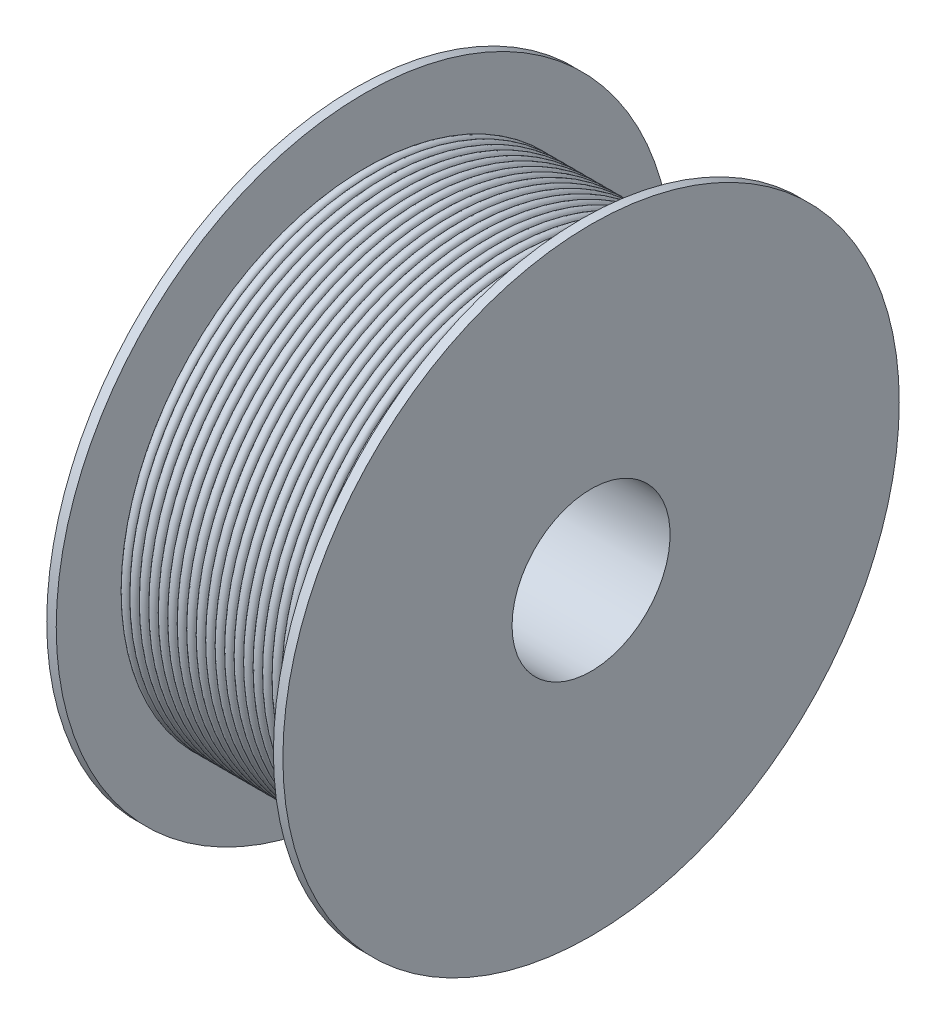
ISO-10303-21;
HEADER;
FILE_DESCRIPTION(('STEP AP214'),'2;1');
FILE_NAME('part.step','',(''),(''),'','','');
FILE_SCHEMA(('AUTOMOTIVE_DESIGN { 1 0 10303 214 1 1 1 1 }'));
ENDSEC;
DATA;
#1=APPLICATION_CONTEXT('core data for automotive mechanical design processes');
#2=APPLICATION_PROTOCOL_DEFINITION('international standard','automotive_design',2000,#1);
#3=PRODUCT_CONTEXT('',#1,'mechanical');
#4=PRODUCT('Part','Part','',(#3));
#5=PRODUCT_RELATED_PRODUCT_CATEGORY('part','',(#4));
#6=PRODUCT_DEFINITION_FORMATION('','',#4);
#7=PRODUCT_DEFINITION_CONTEXT('part definition',#1,'design');
#8=PRODUCT_DEFINITION('design','',#6,#7);
#9=PRODUCT_DEFINITION_SHAPE('','',#8);
#10=(LENGTH_UNIT() NAMED_UNIT(*) SI_UNIT(.MILLI.,.METRE.));
#11=(NAMED_UNIT(*) PLANE_ANGLE_UNIT() SI_UNIT($,.RADIAN.));
#12=(NAMED_UNIT(*) SI_UNIT($,.STERADIAN.) SOLID_ANGLE_UNIT());
#13=UNCERTAINTY_MEASURE_WITH_UNIT(LENGTH_MEASURE(1.E-05),#10,'distance_accuracy_value','');
#14=(GEOMETRIC_REPRESENTATION_CONTEXT(3) GLOBAL_UNCERTAINTY_ASSIGNED_CONTEXT((#13)) GLOBAL_UNIT_ASSIGNED_CONTEXT((#10,
#11,#12)) REPRESENTATION_CONTEXT('',''));
#15=CARTESIAN_POINT('',(0.,0.,0.));
#16=DIRECTION('',(0.,0.,1.));
#17=DIRECTION('',(1.,0.,0.));
#18=AXIS2_PLACEMENT_3D('',#15,#16,#17);
#19=CARTESIAN_POINT('',(-2.32735630179795,0.,-33.7830387952373));
#20=DIRECTION('',(-1.,0.,0.));
#21=DIRECTION('',(0.,0.,1.));
#22=AXIS2_PLACEMENT_3D('',#19,#20,#21);
#23=CYLINDRICAL_SURFACE('',#22,97.5);
#24=CARTESIAN_POINT('',(0.,0.,-33.7830387952373));
#25=DIRECTION('',(-1.,0.,0.));
#26=DIRECTION('',(0.,0.,1.));
#27=AXIS2_PLACEMENT_3D('',#24,#25,#26);
#28=CIRCLE('',#27,97.5);
#29=CARTESIAN_POINT('',(0.,0.,63.7169612047627));
#30=VERTEX_POINT('',#29);
#31=EDGE_CURVE('E193',#30,#30,#28,.T.);
#32=ORIENTED_EDGE('',*,*,#31,.F.);
#33=EDGE_LOOP('',(#32));
#34=FACE_BOUND('',#33,.T.);
#35=CARTESIAN_POINT('',(3.,0.,-33.7830387952373));
#36=DIRECTION('',(-1.,0.,0.));
#37=DIRECTION('',(0.,0.,1.));
#38=AXIS2_PLACEMENT_3D('',#35,#36,#37);
#39=CIRCLE('',#38,97.5);
#40=CARTESIAN_POINT('',(3.,0.,63.7169612047627));
#41=VERTEX_POINT('',#40);
#42=EDGE_CURVE('E10',#41,#41,#39,.T.);
#43=ORIENTED_EDGE('',*,*,#42,.T.);
#44=EDGE_LOOP('',(#43));
#45=FACE_BOUND('',#44,.T.);
#46=ADVANCED_FACE('F33',(#34,#45),#23,.T.);
#47=CARTESIAN_POINT('',(3.,0.,-131.283038795237));
#48=DIRECTION('',(-1.,0.,0.));
#49=DIRECTION('',(0.,0.,1.));
#50=AXIS2_PLACEMENT_3D('',#47,#48,#49);
#51=PLANE('',#50);
#52=ORIENTED_EDGE('',*,*,#42,.F.);
#53=EDGE_LOOP('',(#52));
#54=FACE_BOUND('',#53,.T.);
#55=CARTESIAN_POINT('',(3.,0.,-33.7830387952373));
#56=DIRECTION('',(-1.,0.,0.));
#57=DIRECTION('',(0.,0.,1.));
#58=AXIS2_PLACEMENT_3D('',#55,#56,#57);
#59=CIRCLE('',#58,76.4060254615636);
#60=CARTESIAN_POINT('',(3.,0.,42.6229866663263));
#61=VERTEX_POINT('',#60);
#62=EDGE_CURVE('E39',#61,#61,#59,.T.);
#63=ORIENTED_EDGE('',*,*,#62,.T.);
#64=EDGE_LOOP('',(#63));
#65=FACE_BOUND('',#64,.T.);
#66=ADVANCED_FACE('F200',(#54,#65),#51,.F.);
#67=CARTESIAN_POINT('',(4.37229886831147,0.,-33.7830387952373));
#68=DIRECTION('',(-1.,0.,0.));
#69=DIRECTION('',(0.,0.,1.));
#70=AXIS2_PLACEMENT_3D('',#67,#68,#69);
#71=TOROIDAL_SURFACE('',#70,76.4060254615636,1.37229886831147);
#72=ORIENTED_EDGE('',*,*,#62,.F.);
#73=EDGE_LOOP('',(#72));
#74=FACE_BOUND('',#73,.T.);
#75=CARTESIAN_POINT('',(5.74459773662295,0.,-33.7830387952373));
#76=DIRECTION('',(-1.,0.,0.));
#77=DIRECTION('',(0.,0.,1.));
#78=AXIS2_PLACEMENT_3D('',#75,#76,#77);
#79=CIRCLE('',#78,76.4060254615636);
#80=CARTESIAN_POINT('',(5.74459773662295,0.,42.6229866663263));
#81=VERTEX_POINT('',#80);
#82=EDGE_CURVE('E43',#81,#81,#79,.T.);
#83=ORIENTED_EDGE('',*,*,#82,.T.);
#84=EDGE_LOOP('',(#83));
#85=FACE_BOUND('',#84,.T.);
#86=ADVANCED_FACE('F204',(#74,#85),#71,.T.);
#87=CARTESIAN_POINT('',(7.11689660493443,0.,-33.7830387952373));
#88=DIRECTION('',(-1.,0.,0.));
#89=DIRECTION('',(0.,0.,1.));
#90=AXIS2_PLACEMENT_3D('',#87,#88,#89);
#91=TOROIDAL_SURFACE('',#90,76.4060254615636,1.37229886831148);
#92=ORIENTED_EDGE('',*,*,#82,.F.);
#93=EDGE_LOOP('',(#92));
#94=FACE_BOUND('',#93,.T.);
#95=CARTESIAN_POINT('',(8.4891954732459,0.,-33.7830387952373));
#96=DIRECTION('',(-1.,0.,0.));
#97=DIRECTION('',(0.,0.,1.));
#98=AXIS2_PLACEMENT_3D('',#95,#96,#97);
#99=CIRCLE('',#98,76.4060254615636);
#100=CARTESIAN_POINT('',(8.4891954732459,0.,42.6229866663263));
#101=VERTEX_POINT('',#100);
#102=EDGE_CURVE('E47',#101,#101,#99,.T.);
#103=ORIENTED_EDGE('',*,*,#102,.T.);
#104=EDGE_LOOP('',(#103));
#105=FACE_BOUND('',#104,.T.);
#106=ADVANCED_FACE('F209',(#94,#105),#91,.T.);
#107=CARTESIAN_POINT('',(-2.32735630179795,0.,-33.7830387952373));
#108=DIRECTION('',(-1.,0.,0.));
#109=DIRECTION('',(0.,0.,1.));
#110=AXIS2_PLACEMENT_3D('',#107,#108,#109);
#111=CYLINDRICAL_SURFACE('',#110,76.4060254615636);
#112=ORIENTED_EDGE('',*,*,#102,.F.);
#113=EDGE_LOOP('',(#112));
#114=FACE_BOUND('',#113,.T.);
#115=CARTESIAN_POINT('',(8.74459773662295,0.,-33.7830387952373));
#116=DIRECTION('',(-1.,0.,0.));
#117=DIRECTION('',(0.,0.,1.));
#118=AXIS2_PLACEMENT_3D('',#115,#116,#117);
#119=CIRCLE('',#118,76.4060254615636);
#120=CARTESIAN_POINT('',(8.74459773662295,0.,42.6229866663263));
#121=VERTEX_POINT('',#120);
#122=EDGE_CURVE('E52',#121,#121,#119,.T.);
#123=ORIENTED_EDGE('',*,*,#122,.T.);
#124=EDGE_LOOP('',(#123));
#125=FACE_BOUND('',#124,.T.);
#126=ADVANCED_FACE('F215',(#114,#125),#111,.T.);
#127=CARTESIAN_POINT('',(10.1168966049344,0.,-33.7830387952373));
#128=DIRECTION('',(-1.,0.,0.));
#129=DIRECTION('',(0.,0.,1.));
#130=AXIS2_PLACEMENT_3D('',#127,#128,#129);
#131=TOROIDAL_SURFACE('',#130,76.4060254615636,1.37229886831148);
#132=ORIENTED_EDGE('',*,*,#122,.F.);
#133=EDGE_LOOP('',(#132));
#134=FACE_BOUND('',#133,.T.);
#135=CARTESIAN_POINT('',(11.4891954732459,0.,-33.7830387952373));
#136=DIRECTION('',(-1.,0.,0.));
#137=DIRECTION('',(0.,0.,1.));
#138=AXIS2_PLACEMENT_3D('',#135,#136,#137);
#139=CIRCLE('',#138,76.4060254615636);
#140=CARTESIAN_POINT('',(11.4891954732459,0.,42.6229866663263));
#141=VERTEX_POINT('',#140);
#142=EDGE_CURVE('E55',#141,#141,#139,.T.);
#143=ORIENTED_EDGE('',*,*,#142,.T.);
#144=EDGE_LOOP('',(#143));
#145=FACE_BOUND('',#144,.T.);
#146=ADVANCED_FACE('F219',(#134,#145),#131,.T.);
#147=CARTESIAN_POINT('',(-2.32735630179795,0.,-33.7830387952373));
#148=DIRECTION('',(-1.,0.,0.));
#149=DIRECTION('',(0.,0.,1.));
#150=AXIS2_PLACEMENT_3D('',#147,#148,#149);
#151=CYLINDRICAL_SURFACE('',#150,76.4060254615636);
#152=ORIENTED_EDGE('',*,*,#142,.F.);
#153=EDGE_LOOP('',(#152));
#154=FACE_BOUND('',#153,.T.);
#155=CARTESIAN_POINT('',(11.744597736623,0.,-33.7830387952373));
#156=DIRECTION('',(-1.,0.,0.));
#157=DIRECTION('',(0.,0.,1.));
#158=AXIS2_PLACEMENT_3D('',#155,#156,#157);
#159=CIRCLE('',#158,76.4060254615636);
#160=CARTESIAN_POINT('',(11.744597736623,0.,42.6229866663263));
#161=VERTEX_POINT('',#160);
#162=EDGE_CURVE('E58',#161,#161,#159,.T.);
#163=ORIENTED_EDGE('',*,*,#162,.T.);
#164=EDGE_LOOP('',(#163));
#165=FACE_BOUND('',#164,.T.);
#166=ADVANCED_FACE('F223',(#154,#165),#151,.T.);
#167=CARTESIAN_POINT('',(13.1168966049344,0.,-33.7830387952373));
#168=DIRECTION('',(-1.,0.,0.));
#169=DIRECTION('',(0.,0.,1.));
#170=AXIS2_PLACEMENT_3D('',#167,#168,#169);
#171=TOROIDAL_SURFACE('',#170,76.4060254615636,1.37229886831148);
#172=ORIENTED_EDGE('',*,*,#162,.F.);
#173=EDGE_LOOP('',(#172));
#174=FACE_BOUND('',#173,.T.);
#175=CARTESIAN_POINT('',(14.4891954732459,0.,-33.7830387952373));
#176=DIRECTION('',(-1.,0.,0.));
#177=DIRECTION('',(0.,0.,1.));
#178=AXIS2_PLACEMENT_3D('',#175,#176,#177);
#179=CIRCLE('',#178,76.4060254615636);
#180=CARTESIAN_POINT('',(14.4891954732459,0.,42.6229866663263));
#181=VERTEX_POINT('',#180);
#182=EDGE_CURVE('E61',#181,#181,#179,.T.);
#183=ORIENTED_EDGE('',*,*,#182,.T.);
#184=EDGE_LOOP('',(#183));
#185=FACE_BOUND('',#184,.T.);
#186=ADVANCED_FACE('F227',(#174,#185),#171,.T.);
#187=CARTESIAN_POINT('',(-2.32735630179795,0.,-33.7830387952373));
#188=DIRECTION('',(-1.,0.,0.));
#189=DIRECTION('',(0.,0.,1.));
#190=AXIS2_PLACEMENT_3D('',#187,#188,#189);
#191=CYLINDRICAL_SURFACE('',#190,76.4060254615636);
#192=ORIENTED_EDGE('',*,*,#182,.F.);
#193=EDGE_LOOP('',(#192));
#194=FACE_BOUND('',#193,.T.);
#195=CARTESIAN_POINT('',(14.744597736623,0.,-33.7830387952373));
#196=DIRECTION('',(-1.,0.,0.));
#197=DIRECTION('',(0.,0.,1.));
#198=AXIS2_PLACEMENT_3D('',#195,#196,#197);
#199=CIRCLE('',#198,76.4060254615636);
#200=CARTESIAN_POINT('',(14.744597736623,0.,42.6229866663263));
#201=VERTEX_POINT('',#200);
#202=EDGE_CURVE('E64',#201,#201,#199,.T.);
#203=ORIENTED_EDGE('',*,*,#202,.T.);
#204=EDGE_LOOP('',(#203));
#205=FACE_BOUND('',#204,.T.);
#206=ADVANCED_FACE('F231',(#194,#205),#191,.T.);
#207=CARTESIAN_POINT('',(16.1168966049344,0.,-33.7830387952373));
#208=DIRECTION('',(-1.,0.,0.));
#209=DIRECTION('',(0.,0.,1.));
#210=AXIS2_PLACEMENT_3D('',#207,#208,#209);
#211=TOROIDAL_SURFACE('',#210,76.4060254615636,1.37229886831148);
#212=ORIENTED_EDGE('',*,*,#202,.F.);
#213=EDGE_LOOP('',(#212));
#214=FACE_BOUND('',#213,.T.);
#215=CARTESIAN_POINT('',(17.4891954732459,0.,-33.7830387952373));
#216=DIRECTION('',(-1.,0.,0.));
#217=DIRECTION('',(0.,0.,1.));
#218=AXIS2_PLACEMENT_3D('',#215,#216,#217);
#219=CIRCLE('',#218,76.4060254615636);
#220=CARTESIAN_POINT('',(17.4891954732459,0.,42.6229866663263));
#221=VERTEX_POINT('',#220);
#222=EDGE_CURVE('E67',#221,#221,#219,.T.);
#223=ORIENTED_EDGE('',*,*,#222,.T.);
#224=EDGE_LOOP('',(#223));
#225=FACE_BOUND('',#224,.T.);
#226=ADVANCED_FACE('F235',(#214,#225),#211,.T.);
#227=CARTESIAN_POINT('',(-2.32735630179795,0.,-33.7830387952373));
#228=DIRECTION('',(-1.,0.,0.));
#229=DIRECTION('',(0.,0.,1.));
#230=AXIS2_PLACEMENT_3D('',#227,#228,#229);
#231=CYLINDRICAL_SURFACE('',#230,76.4060254615636);
#232=ORIENTED_EDGE('',*,*,#222,.F.);
#233=EDGE_LOOP('',(#232));
#234=FACE_BOUND('',#233,.T.);
#235=CARTESIAN_POINT('',(17.7445977366229,0.,-33.7830387952373));
#236=DIRECTION('',(-1.,0.,0.));
#237=DIRECTION('',(0.,0.,1.));
#238=AXIS2_PLACEMENT_3D('',#235,#236,#237);
#239=CIRCLE('',#238,76.4060254615636);
#240=CARTESIAN_POINT('',(17.7445977366229,0.,42.6229866663263));
#241=VERTEX_POINT('',#240);
#242=EDGE_CURVE('E70',#241,#241,#239,.T.);
#243=ORIENTED_EDGE('',*,*,#242,.T.);
#244=EDGE_LOOP('',(#243));
#245=FACE_BOUND('',#244,.T.);
#246=ADVANCED_FACE('F239',(#234,#245),#231,.T.);
#247=CARTESIAN_POINT('',(19.1168966049344,0.,-33.7830387952373));
#248=DIRECTION('',(-1.,0.,0.));
#249=DIRECTION('',(0.,0.,1.));
#250=AXIS2_PLACEMENT_3D('',#247,#248,#249);
#251=TOROIDAL_SURFACE('',#250,76.4060254615636,1.37229886831148);
#252=ORIENTED_EDGE('',*,*,#242,.F.);
#253=EDGE_LOOP('',(#252));
#254=FACE_BOUND('',#253,.T.);
#255=CARTESIAN_POINT('',(20.4891954732459,0.,-33.7830387952373));
#256=DIRECTION('',(-1.,0.,0.));
#257=DIRECTION('',(0.,0.,1.));
#258=AXIS2_PLACEMENT_3D('',#255,#256,#257);
#259=CIRCLE('',#258,76.4060254615636);
#260=CARTESIAN_POINT('',(20.4891954732459,0.,42.6229866663263));
#261=VERTEX_POINT('',#260);
#262=EDGE_CURVE('E73',#261,#261,#259,.T.);
#263=ORIENTED_EDGE('',*,*,#262,.T.);
#264=EDGE_LOOP('',(#263));
#265=FACE_BOUND('',#264,.T.);
#266=ADVANCED_FACE('F243',(#254,#265),#251,.T.);
#267=CARTESIAN_POINT('',(-2.32735630179795,0.,-33.7830387952373));
#268=DIRECTION('',(-1.,0.,0.));
#269=DIRECTION('',(0.,0.,1.));
#270=AXIS2_PLACEMENT_3D('',#267,#268,#269);
#271=CYLINDRICAL_SURFACE('',#270,76.4060254615636);
#272=ORIENTED_EDGE('',*,*,#262,.F.);
#273=EDGE_LOOP('',(#272));
#274=FACE_BOUND('',#273,.T.);
#275=CARTESIAN_POINT('',(20.7445977366229,0.,-33.7830387952373));
#276=DIRECTION('',(-1.,0.,0.));
#277=DIRECTION('',(0.,0.,1.));
#278=AXIS2_PLACEMENT_3D('',#275,#276,#277);
#279=CIRCLE('',#278,76.4060254615636);
#280=CARTESIAN_POINT('',(20.7445977366229,0.,42.6229866663263));
#281=VERTEX_POINT('',#280);
#282=EDGE_CURVE('E76',#281,#281,#279,.T.);
#283=ORIENTED_EDGE('',*,*,#282,.T.);
#284=EDGE_LOOP('',(#283));
#285=FACE_BOUND('',#284,.T.);
#286=ADVANCED_FACE('F247',(#274,#285),#271,.T.);
#287=CARTESIAN_POINT('',(22.1168966049344,0.,-33.7830387952373));
#288=DIRECTION('',(-1.,0.,0.));
#289=DIRECTION('',(0.,0.,1.));
#290=AXIS2_PLACEMENT_3D('',#287,#288,#289);
#291=TOROIDAL_SURFACE('',#290,76.4060254615636,1.37229886831148);
#292=ORIENTED_EDGE('',*,*,#282,.F.);
#293=EDGE_LOOP('',(#292));
#294=FACE_BOUND('',#293,.T.);
#295=CARTESIAN_POINT('',(23.4891954732459,0.,-33.7830387952373));
#296=DIRECTION('',(-1.,0.,0.));
#297=DIRECTION('',(0.,0.,1.));
#298=AXIS2_PLACEMENT_3D('',#295,#296,#297);
#299=CIRCLE('',#298,76.4060254615636);
#300=CARTESIAN_POINT('',(23.4891954732459,0.,42.6229866663263));
#301=VERTEX_POINT('',#300);
#302=EDGE_CURVE('E79',#301,#301,#299,.T.);
#303=ORIENTED_EDGE('',*,*,#302,.T.);
#304=EDGE_LOOP('',(#303));
#305=FACE_BOUND('',#304,.T.);
#306=ADVANCED_FACE('F251',(#294,#305),#291,.T.);
#307=CARTESIAN_POINT('',(-2.32735630179795,0.,-33.7830387952373));
#308=DIRECTION('',(-1.,0.,0.));
#309=DIRECTION('',(0.,0.,1.));
#310=AXIS2_PLACEMENT_3D('',#307,#308,#309);
#311=CYLINDRICAL_SURFACE('',#310,76.4060254615636);
#312=ORIENTED_EDGE('',*,*,#302,.F.);
#313=EDGE_LOOP('',(#312));
#314=FACE_BOUND('',#313,.T.);
#315=CARTESIAN_POINT('',(23.744597736623,0.,-33.7830387952373));
#316=DIRECTION('',(-1.,0.,0.));
#317=DIRECTION('',(0.,0.,1.));
#318=AXIS2_PLACEMENT_3D('',#315,#316,#317);
#319=CIRCLE('',#318,76.4060254615636);
#320=CARTESIAN_POINT('',(23.744597736623,0.,42.6229866663263));
#321=VERTEX_POINT('',#320);
#322=EDGE_CURVE('E82',#321,#321,#319,.T.);
#323=ORIENTED_EDGE('',*,*,#322,.T.);
#324=EDGE_LOOP('',(#323));
#325=FACE_BOUND('',#324,.T.);
#326=ADVANCED_FACE('F255',(#314,#325),#311,.T.);
#327=CARTESIAN_POINT('',(25.1168966049344,0.,-33.7830387952373));
#328=DIRECTION('',(-1.,0.,0.));
#329=DIRECTION('',(0.,0.,1.));
#330=AXIS2_PLACEMENT_3D('',#327,#328,#329);
#331=TOROIDAL_SURFACE('',#330,76.4060254615636,1.37229886831148);
#332=ORIENTED_EDGE('',*,*,#322,.F.);
#333=EDGE_LOOP('',(#332));
#334=FACE_BOUND('',#333,.T.);
#335=CARTESIAN_POINT('',(26.4891954732459,0.,-33.7830387952373));
#336=DIRECTION('',(-1.,0.,0.));
#337=DIRECTION('',(0.,0.,1.));
#338=AXIS2_PLACEMENT_3D('',#335,#336,#337);
#339=CIRCLE('',#338,76.4060254615636);
#340=CARTESIAN_POINT('',(26.4891954732459,0.,42.6229866663263));
#341=VERTEX_POINT('',#340);
#342=EDGE_CURVE('E85',#341,#341,#339,.T.);
#343=ORIENTED_EDGE('',*,*,#342,.T.);
#344=EDGE_LOOP('',(#343));
#345=FACE_BOUND('',#344,.T.);
#346=ADVANCED_FACE('F259',(#334,#345),#331,.T.);
#347=CARTESIAN_POINT('',(-2.32735630179795,0.,-33.7830387952373));
#348=DIRECTION('',(-1.,0.,0.));
#349=DIRECTION('',(0.,0.,1.));
#350=AXIS2_PLACEMENT_3D('',#347,#348,#349);
#351=CYLINDRICAL_SURFACE('',#350,76.4060254615636);
#352=ORIENTED_EDGE('',*,*,#342,.F.);
#353=EDGE_LOOP('',(#352));
#354=FACE_BOUND('',#353,.T.);
#355=CARTESIAN_POINT('',(26.744597736623,0.,-33.7830387952373));
#356=DIRECTION('',(-1.,0.,0.));
#357=DIRECTION('',(0.,0.,1.));
#358=AXIS2_PLACEMENT_3D('',#355,#356,#357);
#359=CIRCLE('',#358,76.4060254615636);
#360=CARTESIAN_POINT('',(26.744597736623,0.,42.6229866663263));
#361=VERTEX_POINT('',#360);
#362=EDGE_CURVE('E88',#361,#361,#359,.T.);
#363=ORIENTED_EDGE('',*,*,#362,.T.);
#364=EDGE_LOOP('',(#363));
#365=FACE_BOUND('',#364,.T.);
#366=ADVANCED_FACE('F263',(#354,#365),#351,.T.);
#367=CARTESIAN_POINT('',(28.1168966049344,0.,-33.7830387952373));
#368=DIRECTION('',(-1.,0.,0.));
#369=DIRECTION('',(0.,0.,1.));
#370=AXIS2_PLACEMENT_3D('',#367,#368,#369);
#371=TOROIDAL_SURFACE('',#370,76.4060254615636,1.37229886831148);
#372=ORIENTED_EDGE('',*,*,#362,.F.);
#373=EDGE_LOOP('',(#372));
#374=FACE_BOUND('',#373,.T.);
#375=CARTESIAN_POINT('',(29.4891954732459,0.,-33.7830387952373));
#376=DIRECTION('',(-1.,0.,0.));
#377=DIRECTION('',(0.,0.,1.));
#378=AXIS2_PLACEMENT_3D('',#375,#376,#377);
#379=CIRCLE('',#378,76.4060254615636);
#380=CARTESIAN_POINT('',(29.4891954732459,0.,42.6229866663263));
#381=VERTEX_POINT('',#380);
#382=EDGE_CURVE('E91',#381,#381,#379,.T.);
#383=ORIENTED_EDGE('',*,*,#382,.T.);
#384=EDGE_LOOP('',(#383));
#385=FACE_BOUND('',#384,.T.);
#386=ADVANCED_FACE('F267',(#374,#385),#371,.T.);
#387=CARTESIAN_POINT('',(-2.32735630179795,0.,-33.7830387952373));
#388=DIRECTION('',(-1.,0.,0.));
#389=DIRECTION('',(0.,0.,1.));
#390=AXIS2_PLACEMENT_3D('',#387,#388,#389);
#391=CYLINDRICAL_SURFACE('',#390,76.4060254615636);
#392=ORIENTED_EDGE('',*,*,#382,.F.);
#393=EDGE_LOOP('',(#392));
#394=FACE_BOUND('',#393,.T.);
#395=CARTESIAN_POINT('',(29.7445977366229,0.,-33.7830387952373));
#396=DIRECTION('',(-1.,0.,0.));
#397=DIRECTION('',(0.,0.,1.));
#398=AXIS2_PLACEMENT_3D('',#395,#396,#397);
#399=CIRCLE('',#398,76.4060254615636);
#400=CARTESIAN_POINT('',(29.7445977366229,0.,42.6229866663263));
#401=VERTEX_POINT('',#400);
#402=EDGE_CURVE('E94',#401,#401,#399,.T.);
#403=ORIENTED_EDGE('',*,*,#402,.T.);
#404=EDGE_LOOP('',(#403));
#405=FACE_BOUND('',#404,.T.);
#406=ADVANCED_FACE('F271',(#394,#405),#391,.T.);
#407=CARTESIAN_POINT('',(31.1168966049344,0.,-33.7830387952373));
#408=DIRECTION('',(-1.,0.,0.));
#409=DIRECTION('',(0.,0.,1.));
#410=AXIS2_PLACEMENT_3D('',#407,#408,#409);
#411=TOROIDAL_SURFACE('',#410,76.4060254615636,1.37229886831147);
#412=ORIENTED_EDGE('',*,*,#402,.F.);
#413=EDGE_LOOP('',(#412));
#414=FACE_BOUND('',#413,.T.);
#415=CARTESIAN_POINT('',(32.4891954732459,0.,-33.7830387952373));
#416=DIRECTION('',(-1.,0.,0.));
#417=DIRECTION('',(0.,0.,1.));
#418=AXIS2_PLACEMENT_3D('',#415,#416,#417);
#419=CIRCLE('',#418,76.4060254615636);
#420=CARTESIAN_POINT('',(32.4891954732459,0.,42.6229866663263));
#421=VERTEX_POINT('',#420);
#422=EDGE_CURVE('E97',#421,#421,#419,.T.);
#423=ORIENTED_EDGE('',*,*,#422,.T.);
#424=EDGE_LOOP('',(#423));
#425=FACE_BOUND('',#424,.T.);
#426=ADVANCED_FACE('F275',(#414,#425),#411,.T.);
#427=CARTESIAN_POINT('',(-2.32735630179795,0.,-33.7830387952373));
#428=DIRECTION('',(-1.,0.,0.));
#429=DIRECTION('',(0.,0.,1.));
#430=AXIS2_PLACEMENT_3D('',#427,#428,#429);
#431=CYLINDRICAL_SURFACE('',#430,76.4060254615636);
#432=ORIENTED_EDGE('',*,*,#422,.F.);
#433=EDGE_LOOP('',(#432));
#434=FACE_BOUND('',#433,.T.);
#435=CARTESIAN_POINT('',(32.744597736623,0.,-33.7830387952373));
#436=DIRECTION('',(-1.,0.,0.));
#437=DIRECTION('',(0.,0.,1.));
#438=AXIS2_PLACEMENT_3D('',#435,#436,#437);
#439=CIRCLE('',#438,76.4060254615636);
#440=CARTESIAN_POINT('',(32.744597736623,0.,42.6229866663263));
#441=VERTEX_POINT('',#440);
#442=EDGE_CURVE('E100',#441,#441,#439,.T.);
#443=ORIENTED_EDGE('',*,*,#442,.T.);
#444=EDGE_LOOP('',(#443));
#445=FACE_BOUND('',#444,.T.);
#446=ADVANCED_FACE('F279',(#434,#445),#431,.T.);
#447=CARTESIAN_POINT('',(34.1168966049344,0.,-33.7830387952373));
#448=DIRECTION('',(-1.,0.,0.));
#449=DIRECTION('',(0.,0.,1.));
#450=AXIS2_PLACEMENT_3D('',#447,#448,#449);
#451=TOROIDAL_SURFACE('',#450,76.4060254615636,1.37229886831148);
#452=ORIENTED_EDGE('',*,*,#442,.F.);
#453=EDGE_LOOP('',(#452));
#454=FACE_BOUND('',#453,.T.);
#455=CARTESIAN_POINT('',(35.4891954732459,0.,-33.7830387952373));
#456=DIRECTION('',(-1.,0.,0.));
#457=DIRECTION('',(0.,0.,1.));
#458=AXIS2_PLACEMENT_3D('',#455,#456,#457);
#459=CIRCLE('',#458,76.4060254615636);
#460=CARTESIAN_POINT('',(35.4891954732459,0.,42.6229866663263));
#461=VERTEX_POINT('',#460);
#462=EDGE_CURVE('E103',#461,#461,#459,.T.);
#463=ORIENTED_EDGE('',*,*,#462,.T.);
#464=EDGE_LOOP('',(#463));
#465=FACE_BOUND('',#464,.T.);
#466=ADVANCED_FACE('F283',(#454,#465),#451,.T.);
#467=CARTESIAN_POINT('',(-2.32735630179795,0.,-33.7830387952373));
#468=DIRECTION('',(-1.,0.,0.));
#469=DIRECTION('',(0.,0.,1.));
#470=AXIS2_PLACEMENT_3D('',#467,#468,#469);
#471=CYLINDRICAL_SURFACE('',#470,76.4060254615636);
#472=ORIENTED_EDGE('',*,*,#462,.F.);
#473=EDGE_LOOP('',(#472));
#474=FACE_BOUND('',#473,.T.);
#475=CARTESIAN_POINT('',(35.7445977366229,0.,-33.7830387952373));
#476=DIRECTION('',(-1.,0.,0.));
#477=DIRECTION('',(0.,0.,1.));
#478=AXIS2_PLACEMENT_3D('',#475,#476,#477);
#479=CIRCLE('',#478,76.4060254615636);
#480=CARTESIAN_POINT('',(35.7445977366229,0.,42.6229866663263));
#481=VERTEX_POINT('',#480);
#482=EDGE_CURVE('E106',#481,#481,#479,.T.);
#483=ORIENTED_EDGE('',*,*,#482,.T.);
#484=EDGE_LOOP('',(#483));
#485=FACE_BOUND('',#484,.T.);
#486=ADVANCED_FACE('F287',(#474,#485),#471,.T.);
#487=CARTESIAN_POINT('',(37.1168966049344,0.,-33.7830387952373));
#488=DIRECTION('',(-1.,0.,0.));
#489=DIRECTION('',(0.,0.,1.));
#490=AXIS2_PLACEMENT_3D('',#487,#488,#489);
#491=TOROIDAL_SURFACE('',#490,76.4060254615636,1.37229886831148);
#492=ORIENTED_EDGE('',*,*,#482,.F.);
#493=EDGE_LOOP('',(#492));
#494=FACE_BOUND('',#493,.T.);
#495=CARTESIAN_POINT('',(38.4891954732459,0.,-33.7830387952373));
#496=DIRECTION('',(-1.,0.,0.));
#497=DIRECTION('',(0.,0.,1.));
#498=AXIS2_PLACEMENT_3D('',#495,#496,#497);
#499=CIRCLE('',#498,76.4060254615636);
#500=CARTESIAN_POINT('',(38.4891954732459,0.,42.6229866663263));
#501=VERTEX_POINT('',#500);
#502=EDGE_CURVE('E109',#501,#501,#499,.T.);
#503=ORIENTED_EDGE('',*,*,#502,.T.);
#504=EDGE_LOOP('',(#503));
#505=FACE_BOUND('',#504,.T.);
#506=ADVANCED_FACE('F291',(#494,#505),#491,.T.);
#507=CARTESIAN_POINT('',(-2.32735630179795,0.,-33.7830387952373));
#508=DIRECTION('',(-1.,0.,0.));
#509=DIRECTION('',(0.,0.,1.));
#510=AXIS2_PLACEMENT_3D('',#507,#508,#509);
#511=CYLINDRICAL_SURFACE('',#510,76.4060254615636);
#512=ORIENTED_EDGE('',*,*,#502,.F.);
#513=EDGE_LOOP('',(#512));
#514=FACE_BOUND('',#513,.T.);
#515=CARTESIAN_POINT('',(38.7445977366229,0.,-33.7830387952373));
#516=DIRECTION('',(-1.,0.,0.));
#517=DIRECTION('',(0.,0.,1.));
#518=AXIS2_PLACEMENT_3D('',#515,#516,#517);
#519=CIRCLE('',#518,76.4060254615636);
#520=CARTESIAN_POINT('',(38.7445977366229,0.,42.6229866663263));
#521=VERTEX_POINT('',#520);
#522=EDGE_CURVE('E112',#521,#521,#519,.T.);
#523=ORIENTED_EDGE('',*,*,#522,.T.);
#524=EDGE_LOOP('',(#523));
#525=FACE_BOUND('',#524,.T.);
#526=ADVANCED_FACE('F295',(#514,#525),#511,.T.);
#527=CARTESIAN_POINT('',(40.1168966049344,0.,-33.7830387952373));
#528=DIRECTION('',(-1.,0.,0.));
#529=DIRECTION('',(0.,0.,1.));
#530=AXIS2_PLACEMENT_3D('',#527,#528,#529);
#531=TOROIDAL_SURFACE('',#530,76.4060254615636,1.37229886831148);
#532=ORIENTED_EDGE('',*,*,#522,.F.);
#533=EDGE_LOOP('',(#532));
#534=FACE_BOUND('',#533,.T.);
#535=CARTESIAN_POINT('',(41.4891954732459,0.,-33.7830387952373));
#536=DIRECTION('',(-1.,0.,0.));
#537=DIRECTION('',(0.,0.,1.));
#538=AXIS2_PLACEMENT_3D('',#535,#536,#537);
#539=CIRCLE('',#538,76.4060254615636);
#540=CARTESIAN_POINT('',(41.4891954732459,0.,42.6229866663263));
#541=VERTEX_POINT('',#540);
#542=EDGE_CURVE('E115',#541,#541,#539,.T.);
#543=ORIENTED_EDGE('',*,*,#542,.T.);
#544=EDGE_LOOP('',(#543));
#545=FACE_BOUND('',#544,.T.);
#546=ADVANCED_FACE('F299',(#534,#545),#531,.T.);
#547=CARTESIAN_POINT('',(-2.32735630179795,0.,-33.7830387952373));
#548=DIRECTION('',(-1.,0.,0.));
#549=DIRECTION('',(0.,0.,1.));
#550=AXIS2_PLACEMENT_3D('',#547,#548,#549);
#551=CYLINDRICAL_SURFACE('',#550,76.4060254615636);
#552=ORIENTED_EDGE('',*,*,#542,.F.);
#553=EDGE_LOOP('',(#552));
#554=FACE_BOUND('',#553,.T.);
#555=CARTESIAN_POINT('',(41.7445977366229,0.,-33.7830387952373));
#556=DIRECTION('',(-1.,0.,0.));
#557=DIRECTION('',(0.,0.,1.));
#558=AXIS2_PLACEMENT_3D('',#555,#556,#557);
#559=CIRCLE('',#558,76.4060254615636);
#560=CARTESIAN_POINT('',(41.7445977366229,0.,42.6229866663263));
#561=VERTEX_POINT('',#560);
#562=EDGE_CURVE('E118',#561,#561,#559,.T.);
#563=ORIENTED_EDGE('',*,*,#562,.T.);
#564=EDGE_LOOP('',(#563));
#565=FACE_BOUND('',#564,.T.);
#566=ADVANCED_FACE('F303',(#554,#565),#551,.T.);
#567=CARTESIAN_POINT('',(43.1168966049344,0.,-33.7830387952373));
#568=DIRECTION('',(-1.,0.,0.));
#569=DIRECTION('',(0.,0.,1.));
#570=AXIS2_PLACEMENT_3D('',#567,#568,#569);
#571=TOROIDAL_SURFACE('',#570,76.4060254615636,1.37229886831148);
#572=ORIENTED_EDGE('',*,*,#562,.F.);
#573=EDGE_LOOP('',(#572));
#574=FACE_BOUND('',#573,.T.);
#575=CARTESIAN_POINT('',(44.4891954732459,0.,-33.7830387952373));
#576=DIRECTION('',(-1.,0.,0.));
#577=DIRECTION('',(0.,0.,1.));
#578=AXIS2_PLACEMENT_3D('',#575,#576,#577);
#579=CIRCLE('',#578,76.4060254615636);
#580=CARTESIAN_POINT('',(44.4891954732459,0.,42.6229866663263));
#581=VERTEX_POINT('',#580);
#582=EDGE_CURVE('E121',#581,#581,#579,.T.);
#583=ORIENTED_EDGE('',*,*,#582,.T.);
#584=EDGE_LOOP('',(#583));
#585=FACE_BOUND('',#584,.T.);
#586=ADVANCED_FACE('F307',(#574,#585),#571,.T.);
#587=CARTESIAN_POINT('',(-2.32735630179795,0.,-33.7830387952373));
#588=DIRECTION('',(-1.,0.,0.));
#589=DIRECTION('',(0.,0.,1.));
#590=AXIS2_PLACEMENT_3D('',#587,#588,#589);
#591=CYLINDRICAL_SURFACE('',#590,76.4060254615636);
#592=ORIENTED_EDGE('',*,*,#582,.F.);
#593=EDGE_LOOP('',(#592));
#594=FACE_BOUND('',#593,.T.);
#595=CARTESIAN_POINT('',(44.744597736623,0.,-33.7830387952373));
#596=DIRECTION('',(-1.,0.,0.));
#597=DIRECTION('',(0.,0.,1.));
#598=AXIS2_PLACEMENT_3D('',#595,#596,#597);
#599=CIRCLE('',#598,76.4060254615636);
#600=CARTESIAN_POINT('',(44.744597736623,0.,42.6229866663263));
#601=VERTEX_POINT('',#600);
#602=EDGE_CURVE('E124',#601,#601,#599,.T.);
#603=ORIENTED_EDGE('',*,*,#602,.T.);
#604=EDGE_LOOP('',(#603));
#605=FACE_BOUND('',#604,.T.);
#606=ADVANCED_FACE('F311',(#594,#605),#591,.T.);
#607=CARTESIAN_POINT('',(46.1168966049344,0.,-33.7830387952373));
#608=DIRECTION('',(-1.,0.,0.));
#609=DIRECTION('',(0.,0.,1.));
#610=AXIS2_PLACEMENT_3D('',#607,#608,#609);
#611=TOROIDAL_SURFACE('',#610,76.4060254615636,1.37229886831148);
#612=ORIENTED_EDGE('',*,*,#602,.F.);
#613=EDGE_LOOP('',(#612));
#614=FACE_BOUND('',#613,.T.);
#615=CARTESIAN_POINT('',(47.4891954732459,0.,-33.7830387952373));
#616=DIRECTION('',(-1.,0.,0.));
#617=DIRECTION('',(0.,0.,1.));
#618=AXIS2_PLACEMENT_3D('',#615,#616,#617);
#619=CIRCLE('',#618,76.4060254615636);
#620=CARTESIAN_POINT('',(47.4891954732459,0.,42.6229866663263));
#621=VERTEX_POINT('',#620);
#622=EDGE_CURVE('E127',#621,#621,#619,.T.);
#623=ORIENTED_EDGE('',*,*,#622,.T.);
#624=EDGE_LOOP('',(#623));
#625=FACE_BOUND('',#624,.T.);
#626=ADVANCED_FACE('F315',(#614,#625),#611,.T.);
#627=CARTESIAN_POINT('',(-2.32735630179795,0.,-33.7830387952373));
#628=DIRECTION('',(-1.,0.,0.));
#629=DIRECTION('',(0.,0.,1.));
#630=AXIS2_PLACEMENT_3D('',#627,#628,#629);
#631=CYLINDRICAL_SURFACE('',#630,76.4060254615636);
#632=ORIENTED_EDGE('',*,*,#622,.F.);
#633=EDGE_LOOP('',(#632));
#634=FACE_BOUND('',#633,.T.);
#635=CARTESIAN_POINT('',(47.744597736623,0.,-33.7830387952373));
#636=DIRECTION('',(-1.,0.,0.));
#637=DIRECTION('',(0.,0.,1.));
#638=AXIS2_PLACEMENT_3D('',#635,#636,#637);
#639=CIRCLE('',#638,76.4060254615636);
#640=CARTESIAN_POINT('',(47.744597736623,0.,42.6229866663263));
#641=VERTEX_POINT('',#640);
#642=EDGE_CURVE('E130',#641,#641,#639,.T.);
#643=ORIENTED_EDGE('',*,*,#642,.T.);
#644=EDGE_LOOP('',(#643));
#645=FACE_BOUND('',#644,.T.);
#646=ADVANCED_FACE('F319',(#634,#645),#631,.T.);
#647=CARTESIAN_POINT('',(49.1168966049344,0.,-33.7830387952373));
#648=DIRECTION('',(-1.,0.,0.));
#649=DIRECTION('',(0.,0.,1.));
#650=AXIS2_PLACEMENT_3D('',#647,#648,#649);
#651=TOROIDAL_SURFACE('',#650,76.4060254615636,1.37229886831148);
#652=ORIENTED_EDGE('',*,*,#642,.F.);
#653=EDGE_LOOP('',(#652));
#654=FACE_BOUND('',#653,.T.);
#655=CARTESIAN_POINT('',(50.4891954732459,0.,-33.7830387952373));
#656=DIRECTION('',(-1.,0.,0.));
#657=DIRECTION('',(0.,0.,1.));
#658=AXIS2_PLACEMENT_3D('',#655,#656,#657);
#659=CIRCLE('',#658,76.4060254615636);
#660=CARTESIAN_POINT('',(50.4891954732459,0.,42.6229866663263));
#661=VERTEX_POINT('',#660);
#662=EDGE_CURVE('E133',#661,#661,#659,.T.);
#663=ORIENTED_EDGE('',*,*,#662,.T.);
#664=EDGE_LOOP('',(#663));
#665=FACE_BOUND('',#664,.T.);
#666=ADVANCED_FACE('F323',(#654,#665),#651,.T.);
#667=CARTESIAN_POINT('',(-2.32735630179795,0.,-33.7830387952373));
#668=DIRECTION('',(-1.,0.,0.));
#669=DIRECTION('',(0.,0.,1.));
#670=AXIS2_PLACEMENT_3D('',#667,#668,#669);
#671=CYLINDRICAL_SURFACE('',#670,76.4060254615636);
#672=ORIENTED_EDGE('',*,*,#662,.F.);
#673=EDGE_LOOP('',(#672));
#674=FACE_BOUND('',#673,.T.);
#675=CARTESIAN_POINT('',(50.7445977366229,0.,-33.7830387952373));
#676=DIRECTION('',(-1.,0.,0.));
#677=DIRECTION('',(0.,0.,1.));
#678=AXIS2_PLACEMENT_3D('',#675,#676,#677);
#679=CIRCLE('',#678,76.4060254615636);
#680=CARTESIAN_POINT('',(50.7445977366229,0.,42.6229866663263));
#681=VERTEX_POINT('',#680);
#682=EDGE_CURVE('E136',#681,#681,#679,.T.);
#683=ORIENTED_EDGE('',*,*,#682,.T.);
#684=EDGE_LOOP('',(#683));
#685=FACE_BOUND('',#684,.T.);
#686=ADVANCED_FACE('F327',(#674,#685),#671,.T.);
#687=CARTESIAN_POINT('',(52.1168966049344,0.,-33.7830387952373));
#688=DIRECTION('',(-1.,0.,0.));
#689=DIRECTION('',(0.,0.,1.));
#690=AXIS2_PLACEMENT_3D('',#687,#688,#689);
#691=TOROIDAL_SURFACE('',#690,76.4060254615636,1.37229886831148);
#692=ORIENTED_EDGE('',*,*,#682,.F.);
#693=EDGE_LOOP('',(#692));
#694=FACE_BOUND('',#693,.T.);
#695=CARTESIAN_POINT('',(53.4891954732459,0.,-33.7830387952373));
#696=DIRECTION('',(-1.,0.,0.));
#697=DIRECTION('',(0.,0.,1.));
#698=AXIS2_PLACEMENT_3D('',#695,#696,#697);
#699=CIRCLE('',#698,76.4060254615636);
#700=CARTESIAN_POINT('',(53.4891954732459,0.,42.6229866663263));
#701=VERTEX_POINT('',#700);
#702=EDGE_CURVE('E139',#701,#701,#699,.T.);
#703=ORIENTED_EDGE('',*,*,#702,.T.);
#704=EDGE_LOOP('',(#703));
#705=FACE_BOUND('',#704,.T.);
#706=ADVANCED_FACE('F331',(#694,#705),#691,.T.);
#707=CARTESIAN_POINT('',(-2.32735630179795,0.,-33.7830387952373));
#708=DIRECTION('',(-1.,0.,0.));
#709=DIRECTION('',(0.,0.,1.));
#710=AXIS2_PLACEMENT_3D('',#707,#708,#709);
#711=CYLINDRICAL_SURFACE('',#710,76.4060254615636);
#712=ORIENTED_EDGE('',*,*,#702,.F.);
#713=EDGE_LOOP('',(#712));
#714=FACE_BOUND('',#713,.T.);
#715=CARTESIAN_POINT('',(53.7445977366229,0.,-33.7830387952373));
#716=DIRECTION('',(-1.,0.,0.));
#717=DIRECTION('',(0.,0.,1.));
#718=AXIS2_PLACEMENT_3D('',#715,#716,#717);
#719=CIRCLE('',#718,76.4060254615636);
#720=CARTESIAN_POINT('',(53.7445977366229,0.,42.6229866663263));
#721=VERTEX_POINT('',#720);
#722=EDGE_CURVE('E142',#721,#721,#719,.T.);
#723=ORIENTED_EDGE('',*,*,#722,.T.);
#724=EDGE_LOOP('',(#723));
#725=FACE_BOUND('',#724,.T.);
#726=ADVANCED_FACE('F335',(#714,#725),#711,.T.);
#727=CARTESIAN_POINT('',(55.1168966049344,0.,-33.7830387952373));
#728=DIRECTION('',(-1.,0.,0.));
#729=DIRECTION('',(0.,0.,1.));
#730=AXIS2_PLACEMENT_3D('',#727,#728,#729);
#731=TOROIDAL_SURFACE('',#730,76.4060254615636,1.37229886831148);
#732=ORIENTED_EDGE('',*,*,#722,.F.);
#733=EDGE_LOOP('',(#732));
#734=FACE_BOUND('',#733,.T.);
#735=CARTESIAN_POINT('',(56.4891954732459,0.,-33.7830387952373));
#736=DIRECTION('',(-1.,0.,0.));
#737=DIRECTION('',(0.,0.,1.));
#738=AXIS2_PLACEMENT_3D('',#735,#736,#737);
#739=CIRCLE('',#738,76.4060254615636);
#740=CARTESIAN_POINT('',(56.4891954732459,0.,42.6229866663263));
#741=VERTEX_POINT('',#740);
#742=EDGE_CURVE('E145',#741,#741,#739,.T.);
#743=ORIENTED_EDGE('',*,*,#742,.T.);
#744=EDGE_LOOP('',(#743));
#745=FACE_BOUND('',#744,.T.);
#746=ADVANCED_FACE('F339',(#734,#745),#731,.T.);
#747=CARTESIAN_POINT('',(-2.32735630179795,0.,-33.7830387952373));
#748=DIRECTION('',(-1.,0.,0.));
#749=DIRECTION('',(0.,0.,1.));
#750=AXIS2_PLACEMENT_3D('',#747,#748,#749);
#751=CYLINDRICAL_SURFACE('',#750,76.4060254615636);
#752=ORIENTED_EDGE('',*,*,#742,.F.);
#753=EDGE_LOOP('',(#752));
#754=FACE_BOUND('',#753,.T.);
#755=CARTESIAN_POINT('',(56.7445977366229,0.,-33.7830387952373));
#756=DIRECTION('',(-1.,0.,0.));
#757=DIRECTION('',(0.,0.,1.));
#758=AXIS2_PLACEMENT_3D('',#755,#756,#757);
#759=CIRCLE('',#758,76.4060254615636);
#760=CARTESIAN_POINT('',(56.7445977366229,0.,42.6229866663263));
#761=VERTEX_POINT('',#760);
#762=EDGE_CURVE('E148',#761,#761,#759,.T.);
#763=ORIENTED_EDGE('',*,*,#762,.T.);
#764=EDGE_LOOP('',(#763));
#765=FACE_BOUND('',#764,.T.);
#766=ADVANCED_FACE('F343',(#754,#765),#751,.T.);
#767=CARTESIAN_POINT('',(58.1168966049344,0.,-33.7830387952373));
#768=DIRECTION('',(-1.,0.,0.));
#769=DIRECTION('',(0.,0.,1.));
#770=AXIS2_PLACEMENT_3D('',#767,#768,#769);
#771=TOROIDAL_SURFACE('',#770,76.4060254615636,1.37229886831148);
#772=ORIENTED_EDGE('',*,*,#762,.F.);
#773=EDGE_LOOP('',(#772));
#774=FACE_BOUND('',#773,.T.);
#775=CARTESIAN_POINT('',(59.4891954732459,0.,-33.7830387952373));
#776=DIRECTION('',(-1.,0.,0.));
#777=DIRECTION('',(0.,0.,1.));
#778=AXIS2_PLACEMENT_3D('',#775,#776,#777);
#779=CIRCLE('',#778,76.4060254615636);
#780=CARTESIAN_POINT('',(59.4891954732459,0.,42.6229866663263));
#781=VERTEX_POINT('',#780);
#782=EDGE_CURVE('E151',#781,#781,#779,.T.);
#783=ORIENTED_EDGE('',*,*,#782,.T.);
#784=EDGE_LOOP('',(#783));
#785=FACE_BOUND('',#784,.T.);
#786=ADVANCED_FACE('F347',(#774,#785),#771,.T.);
#787=CARTESIAN_POINT('',(-2.32735630179795,0.,-33.7830387952373));
#788=DIRECTION('',(-1.,0.,0.));
#789=DIRECTION('',(0.,0.,1.));
#790=AXIS2_PLACEMENT_3D('',#787,#788,#789);
#791=CYLINDRICAL_SURFACE('',#790,76.4060254615636);
#792=ORIENTED_EDGE('',*,*,#782,.F.);
#793=EDGE_LOOP('',(#792));
#794=FACE_BOUND('',#793,.T.);
#795=CARTESIAN_POINT('',(59.744597736623,0.,-33.7830387952373));
#796=DIRECTION('',(-1.,0.,0.));
#797=DIRECTION('',(0.,0.,1.));
#798=AXIS2_PLACEMENT_3D('',#795,#796,#797);
#799=CIRCLE('',#798,76.4060254615636);
#800=CARTESIAN_POINT('',(59.744597736623,0.,42.6229866663263));
#801=VERTEX_POINT('',#800);
#802=EDGE_CURVE('E154',#801,#801,#799,.T.);
#803=ORIENTED_EDGE('',*,*,#802,.T.);
#804=EDGE_LOOP('',(#803));
#805=FACE_BOUND('',#804,.T.);
#806=ADVANCED_FACE('F351',(#794,#805),#791,.T.);
#807=CARTESIAN_POINT('',(61.1168966049344,0.,-33.7830387952373));
#808=DIRECTION('',(-1.,0.,0.));
#809=DIRECTION('',(0.,0.,1.));
#810=AXIS2_PLACEMENT_3D('',#807,#808,#809);
#811=TOROIDAL_SURFACE('',#810,76.4060254615636,1.37229886831148);
#812=ORIENTED_EDGE('',*,*,#802,.F.);
#813=EDGE_LOOP('',(#812));
#814=FACE_BOUND('',#813,.T.);
#815=CARTESIAN_POINT('',(62.4891954732459,0.,-33.7830387952373));
#816=DIRECTION('',(-1.,0.,0.));
#817=DIRECTION('',(0.,0.,1.));
#818=AXIS2_PLACEMENT_3D('',#815,#816,#817);
#819=CIRCLE('',#818,76.4060254615636);
#820=CARTESIAN_POINT('',(62.4891954732459,0.,42.6229866663263));
#821=VERTEX_POINT('',#820);
#822=EDGE_CURVE('E157',#821,#821,#819,.T.);
#823=ORIENTED_EDGE('',*,*,#822,.T.);
#824=EDGE_LOOP('',(#823));
#825=FACE_BOUND('',#824,.T.);
#826=ADVANCED_FACE('F355',(#814,#825),#811,.T.);
#827=CARTESIAN_POINT('',(-2.32735630179795,0.,-33.7830387952373));
#828=DIRECTION('',(-1.,0.,0.));
#829=DIRECTION('',(0.,0.,1.));
#830=AXIS2_PLACEMENT_3D('',#827,#828,#829);
#831=CYLINDRICAL_SURFACE('',#830,76.4060254615636);
#832=ORIENTED_EDGE('',*,*,#822,.F.);
#833=EDGE_LOOP('',(#832));
#834=FACE_BOUND('',#833,.T.);
#835=CARTESIAN_POINT('',(62.744597736623,0.,-33.7830387952373));
#836=DIRECTION('',(-1.,0.,0.));
#837=DIRECTION('',(0.,0.,1.));
#838=AXIS2_PLACEMENT_3D('',#835,#836,#837);
#839=CIRCLE('',#838,76.4060254615636);
#840=CARTESIAN_POINT('',(62.744597736623,0.,42.6229866663263));
#841=VERTEX_POINT('',#840);
#842=EDGE_CURVE('E160',#841,#841,#839,.T.);
#843=ORIENTED_EDGE('',*,*,#842,.T.);
#844=EDGE_LOOP('',(#843));
#845=FACE_BOUND('',#844,.T.);
#846=ADVANCED_FACE('F359',(#834,#845),#831,.T.);
#847=CARTESIAN_POINT('',(64.1168966049344,0.,-33.7830387952373));
#848=DIRECTION('',(-1.,0.,0.));
#849=DIRECTION('',(0.,0.,1.));
#850=AXIS2_PLACEMENT_3D('',#847,#848,#849);
#851=TOROIDAL_SURFACE('',#850,76.4060254615636,1.37229886831147);
#852=ORIENTED_EDGE('',*,*,#842,.F.);
#853=EDGE_LOOP('',(#852));
#854=FACE_BOUND('',#853,.T.);
#855=CARTESIAN_POINT('',(65.4891954732459,0.,-33.7830387952373));
#856=DIRECTION('',(-1.,0.,0.));
#857=DIRECTION('',(0.,0.,1.));
#858=AXIS2_PLACEMENT_3D('',#855,#856,#857);
#859=CIRCLE('',#858,76.4060254615636);
#860=CARTESIAN_POINT('',(65.4891954732459,0.,42.6229866663263));
#861=VERTEX_POINT('',#860);
#862=EDGE_CURVE('E163',#861,#861,#859,.T.);
#863=ORIENTED_EDGE('',*,*,#862,.T.);
#864=EDGE_LOOP('',(#863));
#865=FACE_BOUND('',#864,.T.);
#866=ADVANCED_FACE('F363',(#854,#865),#851,.T.);
#867=CARTESIAN_POINT('',(-2.32735630179795,0.,-33.7830387952373));
#868=DIRECTION('',(-1.,0.,0.));
#869=DIRECTION('',(0.,0.,1.));
#870=AXIS2_PLACEMENT_3D('',#867,#868,#869);
#871=CYLINDRICAL_SURFACE('',#870,76.4060254615636);
#872=ORIENTED_EDGE('',*,*,#862,.F.);
#873=EDGE_LOOP('',(#872));
#874=FACE_BOUND('',#873,.T.);
#875=CARTESIAN_POINT('',(65.7445977366229,0.,-33.7830387952373));
#876=DIRECTION('',(-1.,0.,0.));
#877=DIRECTION('',(0.,0.,1.));
#878=AXIS2_PLACEMENT_3D('',#875,#876,#877);
#879=CIRCLE('',#878,76.4060254615636);
#880=CARTESIAN_POINT('',(65.7445977366229,0.,42.6229866663263));
#881=VERTEX_POINT('',#880);
#882=EDGE_CURVE('E166',#881,#881,#879,.T.);
#883=ORIENTED_EDGE('',*,*,#882,.T.);
#884=EDGE_LOOP('',(#883));
#885=FACE_BOUND('',#884,.T.);
#886=ADVANCED_FACE('F367',(#874,#885),#871,.T.);
#887=CARTESIAN_POINT('',(67.1168966049344,0.,-33.7830387952373));
#888=DIRECTION('',(-1.,0.,0.));
#889=DIRECTION('',(0.,0.,1.));
#890=AXIS2_PLACEMENT_3D('',#887,#888,#889);
#891=TOROIDAL_SURFACE('',#890,76.4060254615636,1.37229886831148);
#892=ORIENTED_EDGE('',*,*,#882,.F.);
#893=EDGE_LOOP('',(#892));
#894=FACE_BOUND('',#893,.T.);
#895=CARTESIAN_POINT('',(68.4891954732459,0.,-33.7830387952373));
#896=DIRECTION('',(-1.,0.,0.));
#897=DIRECTION('',(0.,0.,1.));
#898=AXIS2_PLACEMENT_3D('',#895,#896,#897);
#899=CIRCLE('',#898,76.4060254615636);
#900=CARTESIAN_POINT('',(68.4891954732459,0.,42.6229866663263));
#901=VERTEX_POINT('',#900);
#902=EDGE_CURVE('E169',#901,#901,#899,.T.);
#903=ORIENTED_EDGE('',*,*,#902,.T.);
#904=EDGE_LOOP('',(#903));
#905=FACE_BOUND('',#904,.T.);
#906=ADVANCED_FACE('F371',(#894,#905),#891,.T.);
#907=CARTESIAN_POINT('',(-2.32735630179795,0.,-33.7830387952373));
#908=DIRECTION('',(-1.,0.,0.));
#909=DIRECTION('',(0.,0.,1.));
#910=AXIS2_PLACEMENT_3D('',#907,#908,#909);
#911=CYLINDRICAL_SURFACE('',#910,76.4060254615636);
#912=ORIENTED_EDGE('',*,*,#902,.F.);
#913=EDGE_LOOP('',(#912));
#914=FACE_BOUND('',#913,.T.);
#915=CARTESIAN_POINT('',(68.7445977366229,0.,-33.7830387952373));
#916=DIRECTION('',(-1.,0.,0.));
#917=DIRECTION('',(0.,0.,1.));
#918=AXIS2_PLACEMENT_3D('',#915,#916,#917);
#919=CIRCLE('',#918,76.4060254615636);
#920=CARTESIAN_POINT('',(68.7445977366229,0.,42.6229866663263));
#921=VERTEX_POINT('',#920);
#922=EDGE_CURVE('E172',#921,#921,#919,.T.);
#923=ORIENTED_EDGE('',*,*,#922,.T.);
#924=EDGE_LOOP('',(#923));
#925=FACE_BOUND('',#924,.T.);
#926=ADVANCED_FACE('F375',(#914,#925),#911,.T.);
#927=CARTESIAN_POINT('',(70.1168966049344,0.,-33.7830387952373));
#928=DIRECTION('',(-1.,0.,0.));
#929=DIRECTION('',(0.,0.,1.));
#930=AXIS2_PLACEMENT_3D('',#927,#928,#929);
#931=TOROIDAL_SURFACE('',#930,76.4060254615636,1.37229886831148);
#932=ORIENTED_EDGE('',*,*,#922,.F.);
#933=EDGE_LOOP('',(#932));
#934=FACE_BOUND('',#933,.T.);
#935=CARTESIAN_POINT('',(71.4891954732459,0.,-33.7830387952373));
#936=DIRECTION('',(-1.,0.,0.));
#937=DIRECTION('',(0.,0.,1.));
#938=AXIS2_PLACEMENT_3D('',#935,#936,#937);
#939=CIRCLE('',#938,76.4060254615636);
#940=CARTESIAN_POINT('',(71.4891954732459,0.,42.6229866663263));
#941=VERTEX_POINT('',#940);
#942=EDGE_CURVE('E175',#941,#941,#939,.T.);
#943=ORIENTED_EDGE('',*,*,#942,.T.);
#944=EDGE_LOOP('',(#943));
#945=FACE_BOUND('',#944,.T.);
#946=ADVANCED_FACE('F379',(#934,#945),#931,.T.);
#947=CARTESIAN_POINT('',(-2.32735630179795,0.,-33.7830387952373));
#948=DIRECTION('',(-1.,0.,0.));
#949=DIRECTION('',(0.,0.,1.));
#950=AXIS2_PLACEMENT_3D('',#947,#948,#949);
#951=CYLINDRICAL_SURFACE('',#950,76.4060254615636);
#952=ORIENTED_EDGE('',*,*,#942,.F.);
#953=EDGE_LOOP('',(#952));
#954=FACE_BOUND('',#953,.T.);
#955=CARTESIAN_POINT('',(71.7075484586744,0.,-33.7830387952373));
#956=DIRECTION('',(-1.,0.,0.));
#957=DIRECTION('',(0.,0.,1.));
#958=AXIS2_PLACEMENT_3D('',#955,#956,#957);
#959=CIRCLE('',#958,76.4060254615636);
#960=CARTESIAN_POINT('',(71.7075484586744,0.,42.6229866663263));
#961=VERTEX_POINT('',#960);
#962=EDGE_CURVE('E178',#961,#961,#959,.T.);
#963=ORIENTED_EDGE('',*,*,#962,.T.);
#964=EDGE_LOOP('',(#963));
#965=FACE_BOUND('',#964,.T.);
#966=ADVANCED_FACE('F383',(#954,#965),#951,.T.);
#967=CARTESIAN_POINT('',(71.7075484586744,0.,-110.189064256801));
#968=DIRECTION('',(1.,0.,0.));
#969=DIRECTION('',(0.,0.,-1.));
#970=AXIS2_PLACEMENT_3D('',#967,#968,#969);
#971=PLANE('',#970);
#972=ORIENTED_EDGE('',*,*,#962,.F.);
#973=EDGE_LOOP('',(#972));
#974=FACE_BOUND('',#973,.T.);
#975=CARTESIAN_POINT('',(71.7075484586744,0.,-33.7830387952373));
#976=DIRECTION('',(-1.,0.,0.));
#977=DIRECTION('',(0.,0.,1.));
#978=AXIS2_PLACEMENT_3D('',#975,#976,#977);
#979=CIRCLE('',#978,97.5);
#980=CARTESIAN_POINT('',(71.7075484586744,0.,63.7169612047627));
#981=VERTEX_POINT('',#980);
#982=EDGE_CURVE('E181',#981,#981,#979,.T.);
#983=ORIENTED_EDGE('',*,*,#982,.T.);
#984=EDGE_LOOP('',(#983));
#985=FACE_BOUND('',#984,.T.);
#986=ADVANCED_FACE('F387',(#974,#985),#971,.F.);
#987=CARTESIAN_POINT('',(-2.32735630179795,0.,-33.7830387952373));
#988=DIRECTION('',(-1.,0.,0.));
#989=DIRECTION('',(0.,0.,1.));
#990=AXIS2_PLACEMENT_3D('',#987,#988,#989);
#991=CYLINDRICAL_SURFACE('',#990,97.5);
#992=ORIENTED_EDGE('',*,*,#982,.F.);
#993=EDGE_LOOP('',(#992));
#994=FACE_BOUND('',#993,.T.);
#995=CARTESIAN_POINT('',(74.7075484586744,0.,-33.7830387952373));
#996=DIRECTION('',(-1.,0.,0.));
#997=DIRECTION('',(0.,0.,1.));
#998=AXIS2_PLACEMENT_3D('',#995,#996,#997);
#999=CIRCLE('',#998,97.5);
#1000=CARTESIAN_POINT('',(74.7075484586744,0.,63.7169612047627));
#1001=VERTEX_POINT('',#1000);
#1002=EDGE_CURVE('E184',#1001,#1001,#999,.T.);
#1003=ORIENTED_EDGE('',*,*,#1002,.T.);
#1004=EDGE_LOOP('',(#1003));
#1005=FACE_BOUND('',#1004,.T.);
#1006=ADVANCED_FACE('F391',(#994,#1005),#991,.T.);
#1007=CARTESIAN_POINT('',(74.7075484586744,0.,-131.283038795237));
#1008=DIRECTION('',(-1.,0.,0.));
#1009=DIRECTION('',(0.,0.,1.));
#1010=AXIS2_PLACEMENT_3D('',#1007,#1008,#1009);
#1011=PLANE('',#1010);
#1012=ORIENTED_EDGE('',*,*,#1002,.F.);
#1013=EDGE_LOOP('',(#1012));
#1014=FACE_BOUND('',#1013,.T.);
#1015=CARTESIAN_POINT('',(74.7075484586745,0.,-33.7830387952373));
#1016=DIRECTION('',(-1.,0.,0.));
#1017=DIRECTION('',(0.,0.,1.));
#1018=AXIS2_PLACEMENT_3D('',#1015,#1016,#1017);
#1019=CIRCLE('',#1018,25.);
#1020=CARTESIAN_POINT('',(74.7075484586745,0.,-8.78303879523729));
#1021=VERTEX_POINT('',#1020);
#1022=EDGE_CURVE('E187',#1021,#1021,#1019,.T.);
#1023=ORIENTED_EDGE('',*,*,#1022,.T.);
#1024=EDGE_LOOP('',(#1023));
#1025=FACE_BOUND('',#1024,.T.);
#1026=ADVANCED_FACE('F395',(#1014,#1025),#1011,.F.);
#1027=CARTESIAN_POINT('',(-2.32735630179795,0.,-33.7830387952373));
#1028=DIRECTION('',(-1.,0.,0.));
#1029=DIRECTION('',(0.,0.,1.));
#1030=AXIS2_PLACEMENT_3D('',#1027,#1028,#1029);
#1031=CYLINDRICAL_SURFACE('',#1030,25.);
#1032=ORIENTED_EDGE('',*,*,#1022,.F.);
#1033=EDGE_LOOP('',(#1032));
#1034=FACE_BOUND('',#1033,.T.);
#1035=CARTESIAN_POINT('',(0.,0.,-33.7830387952373));
#1036=DIRECTION('',(-1.,0.,0.));
#1037=DIRECTION('',(0.,0.,1.));
#1038=AXIS2_PLACEMENT_3D('',#1035,#1036,#1037);
#1039=CIRCLE('',#1038,25.);
#1040=CARTESIAN_POINT('',(0.,0.,-8.78303879523729));
#1041=VERTEX_POINT('',#1040);
#1042=EDGE_CURVE('E190',#1041,#1041,#1039,.T.);
#1043=ORIENTED_EDGE('',*,*,#1042,.T.);
#1044=EDGE_LOOP('',(#1043));
#1045=FACE_BOUND('',#1044,.T.);
#1046=ADVANCED_FACE('F399',(#1034,#1045),#1031,.F.);
#1047=CARTESIAN_POINT('',(0.,0.,-58.7830387952373));
#1048=DIRECTION('',(1.,0.,0.));
#1049=DIRECTION('',(0.,0.,-1.));
#1050=AXIS2_PLACEMENT_3D('',#1047,#1048,#1049);
#1051=PLANE('',#1050);
#1052=ORIENTED_EDGE('',*,*,#1042,.F.);
#1053=EDGE_LOOP('',(#1052));
#1054=FACE_BOUND('',#1053,.T.);
#1055=ORIENTED_EDGE('',*,*,#31,.T.);
#1056=EDGE_LOOP('',(#1055));
#1057=FACE_BOUND('',#1056,.T.);
#1058=ADVANCED_FACE('F197',(#1054,#1057),#1051,.F.);
#1059=CLOSED_SHELL('',(#46,#66,#86,#106,#126,#146,#166,#186,#206,#226,#246,#266,#286,#306,#326,
#346,#366,#386,#406,#426,#446,#466,#486,#506,#526,#546,#566,#586,#606,#626,#646,#666,#686,#706,
#726,#746,#766,#786,#806,#826,#846,#866,#886,#906,#926,#946,#966,#986,#1006,#1026,#1046,#1058));
#1060=MANIFOLD_SOLID_BREP('B2',#1059);
#1061=ADVANCED_BREP_SHAPE_REPRESENTATION('',(#18,#1060),#14);
#1062=SHAPE_DEFINITION_REPRESENTATION(#9,#1061);
ENDSEC;
END-ISO-10303-21;
